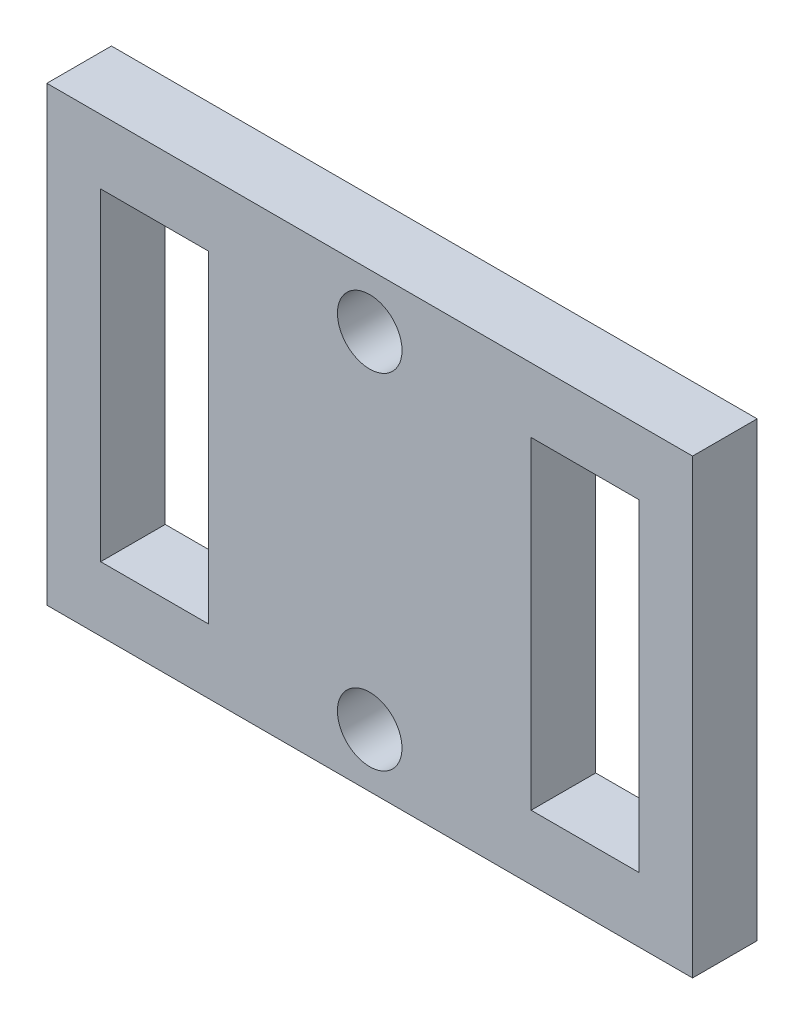
ISO-10303-21;
HEADER;
FILE_DESCRIPTION(('STEP AP214'),'2;1');
FILE_NAME('part.step','',(''),(''),'','','');
FILE_SCHEMA(('AUTOMOTIVE_DESIGN { 1 0 10303 214 1 1 1 1 }'));
ENDSEC;
DATA;
#1=APPLICATION_CONTEXT('core data for automotive mechanical design processes');
#2=APPLICATION_PROTOCOL_DEFINITION('international standard','automotive_design',2000,#1);
#3=PRODUCT_CONTEXT('',#1,'mechanical');
#4=PRODUCT('Part','Part','',(#3));
#5=PRODUCT_RELATED_PRODUCT_CATEGORY('part','',(#4));
#6=PRODUCT_DEFINITION_FORMATION('','',#4);
#7=PRODUCT_DEFINITION_CONTEXT('part definition',#1,'design');
#8=PRODUCT_DEFINITION('design','',#6,#7);
#9=PRODUCT_DEFINITION_SHAPE('','',#8);
#10=(LENGTH_UNIT() NAMED_UNIT(*) SI_UNIT(.MILLI.,.METRE.));
#11=(NAMED_UNIT(*) PLANE_ANGLE_UNIT() SI_UNIT($,.RADIAN.));
#12=(NAMED_UNIT(*) SI_UNIT($,.STERADIAN.) SOLID_ANGLE_UNIT());
#13=UNCERTAINTY_MEASURE_WITH_UNIT(LENGTH_MEASURE(1.E-05),#10,'distance_accuracy_value','');
#14=(GEOMETRIC_REPRESENTATION_CONTEXT(3) GLOBAL_UNCERTAINTY_ASSIGNED_CONTEXT((#13)) GLOBAL_UNIT_ASSIGNED_CONTEXT((#10,
#11,#12)) REPRESENTATION_CONTEXT('',''));
#15=CARTESIAN_POINT('',(0.,0.,0.));
#16=DIRECTION('',(0.,0.,1.));
#17=DIRECTION('',(1.,0.,0.));
#18=AXIS2_PLACEMENT_3D('',#15,#16,#17);
#19=CARTESIAN_POINT('',(0.,0.,3.));
#20=DIRECTION('',(0.,0.,1.));
#21=DIRECTION('',(1.,0.,0.));
#22=AXIS2_PLACEMENT_3D('',#19,#20,#21);
#23=PLANE('',#22);
#24=DIRECTION('',(0.,1.,0.));
#25=VECTOR('',#24,1.);
#26=CARTESIAN_POINT('',(-7.5,7.5,3.));
#27=LINE('',#26,#25);
#28=CARTESIAN_POINT('',(-7.5,-7.5,3.));
#29=VERTEX_POINT('',#28);
#30=CARTESIAN_POINT('',(-7.5,7.5,3.));
#31=VERTEX_POINT('',#30);
#32=EDGE_CURVE('E55',#29,#31,#27,.T.);
#33=ORIENTED_EDGE('',*,*,#32,.F.);
#34=DIRECTION('',(1.,0.,0.));
#35=VECTOR('',#34,1.);
#36=CARTESIAN_POINT('',(-12.5,-7.5,3.));
#37=LINE('',#36,#35);
#38=CARTESIAN_POINT('',(-12.5,-7.5,3.));
#39=VERTEX_POINT('',#38);
#40=EDGE_CURVE('E153',#39,#29,#37,.T.);
#41=ORIENTED_EDGE('',*,*,#40,.F.);
#42=DIRECTION('',(0.,-1.,0.));
#43=VECTOR('',#42,1.);
#44=CARTESIAN_POINT('',(-12.5,7.5,3.));
#45=LINE('',#44,#43);
#46=CARTESIAN_POINT('',(-12.5,7.5,3.));
#47=VERTEX_POINT('',#46);
#48=EDGE_CURVE('E157',#47,#39,#45,.T.);
#49=ORIENTED_EDGE('',*,*,#48,.F.);
#50=DIRECTION('',(-1.,0.,0.));
#51=VECTOR('',#50,1.);
#52=CARTESIAN_POINT('',(-12.5,7.5,3.));
#53=LINE('',#52,#51);
#54=EDGE_CURVE('E166',#31,#47,#53,.T.);
#55=ORIENTED_EDGE('',*,*,#54,.F.);
#56=EDGE_LOOP('',(#33,#41,#49,#55));
#57=FACE_BOUND('',#56,.T.);
#58=DIRECTION('',(0.,1.,0.));
#59=VECTOR('',#58,1.);
#60=CARTESIAN_POINT('',(12.5,7.5,3.));
#61=LINE('',#60,#59);
#62=CARTESIAN_POINT('',(12.5,-7.5,3.));
#63=VERTEX_POINT('',#62);
#64=CARTESIAN_POINT('',(12.5,7.5,3.));
#65=VERTEX_POINT('',#64);
#66=EDGE_CURVE('E63',#63,#65,#61,.T.);
#67=ORIENTED_EDGE('',*,*,#66,.F.);
#68=DIRECTION('',(1.,0.,0.));
#69=VECTOR('',#68,1.);
#70=CARTESIAN_POINT('',(12.5,-7.5,3.));
#71=LINE('',#70,#69);
#72=CARTESIAN_POINT('',(7.5,-7.5,3.));
#73=VERTEX_POINT('',#72);
#74=EDGE_CURVE('E187',#73,#63,#71,.T.);
#75=ORIENTED_EDGE('',*,*,#74,.F.);
#76=DIRECTION('',(0.,-1.,0.));
#77=VECTOR('',#76,1.);
#78=CARTESIAN_POINT('',(7.5,7.5,3.));
#79=LINE('',#78,#77);
#80=CARTESIAN_POINT('',(7.5,7.5,3.));
#81=VERTEX_POINT('',#80);
#82=EDGE_CURVE('E206',#81,#73,#79,.T.);
#83=ORIENTED_EDGE('',*,*,#82,.F.);
#84=DIRECTION('',(-1.,0.,0.));
#85=VECTOR('',#84,1.);
#86=CARTESIAN_POINT('',(12.5,7.5,3.));
#87=LINE('',#86,#85);
#88=EDGE_CURVE('E202',#65,#81,#87,.T.);
#89=ORIENTED_EDGE('',*,*,#88,.F.);
#90=EDGE_LOOP('',(#67,#75,#83,#89));
#91=FACE_BOUND('',#90,.T.);
#92=CARTESIAN_POINT('',(0.,8.,3.));
#93=DIRECTION('',(0.,0.,1.));
#94=DIRECTION('',(1.,0.,0.));
#95=AXIS2_PLACEMENT_3D('',#92,#93,#94);
#96=CIRCLE('',#95,1.5);
#97=CARTESIAN_POINT('',(1.5,8.,3.));
#98=VERTEX_POINT('',#97);
#99=EDGE_CURVE('E231',#98,#98,#96,.T.);
#100=ORIENTED_EDGE('',*,*,#99,.F.);
#101=EDGE_LOOP('',(#100));
#102=FACE_BOUND('',#101,.T.);
#103=DIRECTION('',(0.,1.,0.));
#104=VECTOR('',#103,1.);
#105=CARTESIAN_POINT('',(15.,10.5,3.));
#106=LINE('',#105,#104);
#107=CARTESIAN_POINT('',(15.,-10.5,3.));
#108=VERTEX_POINT('',#107);
#109=CARTESIAN_POINT('',(15.,10.5,3.));
#110=VERTEX_POINT('',#109);
#111=EDGE_CURVE('E239',#108,#110,#106,.T.);
#112=ORIENTED_EDGE('',*,*,#111,.T.);
#113=DIRECTION('',(-1.,0.,0.));
#114=VECTOR('',#113,1.);
#115=CARTESIAN_POINT('',(-15.,10.5,3.));
#116=LINE('',#115,#114);
#117=CARTESIAN_POINT('',(-15.,10.5,3.));
#118=VERTEX_POINT('',#117);
#119=EDGE_CURVE('E243',#110,#118,#116,.T.);
#120=ORIENTED_EDGE('',*,*,#119,.T.);
#121=DIRECTION('',(0.,-1.,0.));
#122=VECTOR('',#121,1.);
#123=CARTESIAN_POINT('',(-15.,10.5,3.));
#124=LINE('',#123,#122);
#125=CARTESIAN_POINT('',(-15.,-10.5,3.));
#126=VERTEX_POINT('',#125);
#127=EDGE_CURVE('E247',#118,#126,#124,.T.);
#128=ORIENTED_EDGE('',*,*,#127,.T.);
#129=DIRECTION('',(1.,0.,0.));
#130=VECTOR('',#129,1.);
#131=CARTESIAN_POINT('',(-15.,-10.5,3.));
#132=LINE('',#131,#130);
#133=EDGE_CURVE('E250',#126,#108,#132,.T.);
#134=ORIENTED_EDGE('',*,*,#133,.T.);
#135=EDGE_LOOP('',(#112,#120,#128,#134));
#136=FACE_BOUND('',#135,.T.);
#137=CARTESIAN_POINT('',(0.,-7.99999999999999,3.));
#138=DIRECTION('',(0.,0.,1.));
#139=DIRECTION('',(-1.,0.,0.));
#140=AXIS2_PLACEMENT_3D('',#137,#138,#139);
#141=CIRCLE('',#140,1.5);
#142=CARTESIAN_POINT('',(-1.50000000000001,-7.99999999999999,3.));
#143=VERTEX_POINT('',#142);
#144=EDGE_CURVE('E223',#143,#143,#141,.T.);
#145=ORIENTED_EDGE('',*,*,#144,.F.);
#146=EDGE_LOOP('',(#145));
#147=FACE_BOUND('',#146,.T.);
#148=ADVANCED_FACE('F39',(#57,#91,#102,#136,#147),#23,.T.);
#149=CARTESIAN_POINT('',(0.,0.,0.));
#150=DIRECTION('',(0.,0.,1.));
#151=DIRECTION('',(1.,0.,0.));
#152=AXIS2_PLACEMENT_3D('',#149,#150,#151);
#153=PLANE('',#152);
#154=DIRECTION('',(1.,0.,0.));
#155=VECTOR('',#154,1.);
#156=CARTESIAN_POINT('',(-12.5,-7.5,0.));
#157=LINE('',#156,#155);
#158=CARTESIAN_POINT('',(-12.5,-7.5,0.));
#159=VERTEX_POINT('',#158);
#160=CARTESIAN_POINT('',(-7.5,-7.5,0.));
#161=VERTEX_POINT('',#160);
#162=EDGE_CURVE('E138',#159,#161,#157,.T.);
#163=ORIENTED_EDGE('',*,*,#162,.T.);
#164=DIRECTION('',(0.,1.,0.));
#165=VECTOR('',#164,1.);
#166=CARTESIAN_POINT('',(-7.5,7.5,0.));
#167=LINE('',#166,#165);
#168=CARTESIAN_POINT('',(-7.5,7.5,0.));
#169=VERTEX_POINT('',#168);
#170=EDGE_CURVE('E131',#161,#169,#167,.T.);
#171=ORIENTED_EDGE('',*,*,#170,.T.);
#172=DIRECTION('',(-1.,0.,0.));
#173=VECTOR('',#172,1.);
#174=CARTESIAN_POINT('',(-12.5,7.5,0.));
#175=LINE('',#174,#173);
#176=CARTESIAN_POINT('',(-12.5,7.5,0.));
#177=VERTEX_POINT('',#176);
#178=EDGE_CURVE('E142',#169,#177,#175,.T.);
#179=ORIENTED_EDGE('',*,*,#178,.T.);
#180=DIRECTION('',(0.,-1.,0.));
#181=VECTOR('',#180,1.);
#182=CARTESIAN_POINT('',(-12.5,7.5,0.));
#183=LINE('',#182,#181);
#184=EDGE_CURVE('E147',#177,#159,#183,.T.);
#185=ORIENTED_EDGE('',*,*,#184,.T.);
#186=EDGE_LOOP('',(#163,#171,#179,#185));
#187=FACE_BOUND('',#186,.T.);
#188=DIRECTION('',(1.,0.,0.));
#189=VECTOR('',#188,1.);
#190=CARTESIAN_POINT('',(12.5,-7.5,0.));
#191=LINE('',#190,#189);
#192=CARTESIAN_POINT('',(7.5,-7.5,0.));
#193=VERTEX_POINT('',#192);
#194=CARTESIAN_POINT('',(12.5,-7.5,0.));
#195=VERTEX_POINT('',#194);
#196=EDGE_CURVE('E195',#193,#195,#191,.T.);
#197=ORIENTED_EDGE('',*,*,#196,.T.);
#198=DIRECTION('',(0.,1.,0.));
#199=VECTOR('',#198,1.);
#200=CARTESIAN_POINT('',(12.5,7.5,0.));
#201=LINE('',#200,#199);
#202=CARTESIAN_POINT('',(12.5,7.5,0.));
#203=VERTEX_POINT('',#202);
#204=EDGE_CURVE('E182',#195,#203,#201,.T.);
#205=ORIENTED_EDGE('',*,*,#204,.T.);
#206=DIRECTION('',(-1.,0.,0.));
#207=VECTOR('',#206,1.);
#208=CARTESIAN_POINT('',(12.5,7.5,0.));
#209=LINE('',#208,#207);
#210=CARTESIAN_POINT('',(7.5,7.5,0.));
#211=VERTEX_POINT('',#210);
#212=EDGE_CURVE('E186',#203,#211,#209,.T.);
#213=ORIENTED_EDGE('',*,*,#212,.T.);
#214=DIRECTION('',(0.,-1.,0.));
#215=VECTOR('',#214,1.);
#216=CARTESIAN_POINT('',(7.5,7.5,0.));
#217=LINE('',#216,#215);
#218=EDGE_CURVE('E191',#211,#193,#217,.T.);
#219=ORIENTED_EDGE('',*,*,#218,.T.);
#220=EDGE_LOOP('',(#197,#205,#213,#219));
#221=FACE_BOUND('',#220,.T.);
#222=DIRECTION('',(0.,1.,0.));
#223=VECTOR('',#222,1.);
#224=CARTESIAN_POINT('',(15.,10.5,0.));
#225=LINE('',#224,#223);
#226=CARTESIAN_POINT('',(15.,-10.5,0.));
#227=VERTEX_POINT('',#226);
#228=CARTESIAN_POINT('',(15.,10.5,0.));
#229=VERTEX_POINT('',#228);
#230=EDGE_CURVE('E235',#227,#229,#225,.T.);
#231=ORIENTED_EDGE('',*,*,#230,.F.);
#232=DIRECTION('',(1.,0.,0.));
#233=VECTOR('',#232,1.);
#234=CARTESIAN_POINT('',(-15.,-10.5,0.));
#235=LINE('',#234,#233);
#236=CARTESIAN_POINT('',(-15.,-10.5,0.));
#237=VERTEX_POINT('',#236);
#238=EDGE_CURVE('E244',#237,#227,#235,.T.);
#239=ORIENTED_EDGE('',*,*,#238,.F.);
#240=DIRECTION('',(0.,-1.,0.));
#241=VECTOR('',#240,1.);
#242=CARTESIAN_POINT('',(-15.,10.5,0.));
#243=LINE('',#242,#241);
#244=CARTESIAN_POINT('',(-15.,10.5,0.));
#245=VERTEX_POINT('',#244);
#246=EDGE_CURVE('E260',#245,#237,#243,.T.);
#247=ORIENTED_EDGE('',*,*,#246,.F.);
#248=DIRECTION('',(-1.,0.,0.));
#249=VECTOR('',#248,1.);
#250=CARTESIAN_POINT('',(-15.,10.5,0.));
#251=LINE('',#250,#249);
#252=EDGE_CURVE('E257',#229,#245,#251,.T.);
#253=ORIENTED_EDGE('',*,*,#252,.F.);
#254=EDGE_LOOP('',(#231,#239,#247,#253));
#255=FACE_BOUND('',#254,.T.);
#256=CARTESIAN_POINT('',(0.,8.,0.));
#257=DIRECTION('',(0.,0.,1.));
#258=DIRECTION('',(1.,0.,0.));
#259=AXIS2_PLACEMENT_3D('',#256,#257,#258);
#260=CIRCLE('',#259,1.5);
#261=CARTESIAN_POINT('',(1.5,8.,0.));
#262=VERTEX_POINT('',#261);
#263=EDGE_CURVE('E227',#262,#262,#260,.T.);
#264=ORIENTED_EDGE('',*,*,#263,.T.);
#265=EDGE_LOOP('',(#264));
#266=FACE_BOUND('',#265,.T.);
#267=CARTESIAN_POINT('',(0.,-7.99999999999999,0.));
#268=DIRECTION('',(0.,0.,1.));
#269=DIRECTION('',(-1.,0.,0.));
#270=AXIS2_PLACEMENT_3D('',#267,#268,#269);
#271=CIRCLE('',#270,1.5);
#272=CARTESIAN_POINT('',(-1.50000000000001,-7.99999999999999,0.));
#273=VERTEX_POINT('',#272);
#274=EDGE_CURVE('E176',#273,#273,#271,.T.);
#275=ORIENTED_EDGE('',*,*,#274,.T.);
#276=EDGE_LOOP('',(#275));
#277=FACE_BOUND('',#276,.T.);
#278=ADVANCED_FACE('F149',(#187,#221,#255,#266,#277),#153,.F.);
#279=CARTESIAN_POINT('',(15.,10.5,3.));
#280=DIRECTION('',(-1.,0.,0.));
#281=DIRECTION('',(0.,-1.,0.));
#282=AXIS2_PLACEMENT_3D('',#279,#280,#281);
#283=PLANE('',#282);
#284=ORIENTED_EDGE('',*,*,#230,.T.);
#285=DIRECTION('',(0.,0.,-1.));
#286=VECTOR('',#285,1.);
#287=CARTESIAN_POINT('',(15.,10.5,3.));
#288=LINE('',#287,#286);
#289=EDGE_CURVE('E11',#110,#229,#288,.T.);
#290=ORIENTED_EDGE('',*,*,#289,.F.);
#291=ORIENTED_EDGE('',*,*,#111,.F.);
#292=DIRECTION('',(0.,0.,-1.));
#293=VECTOR('',#292,1.);
#294=CARTESIAN_POINT('',(15.,-10.5,3.));
#295=LINE('',#294,#293);
#296=EDGE_CURVE('E253',#108,#227,#295,.T.);
#297=ORIENTED_EDGE('',*,*,#296,.T.);
#298=EDGE_LOOP('',(#284,#290,#291,#297));
#299=FACE_BOUND('',#298,.T.);
#300=ADVANCED_FACE('F41',(#299),#283,.F.);
#301=CARTESIAN_POINT('',(-15.,10.5,3.));
#302=DIRECTION('',(0.,-1.,0.));
#303=DIRECTION('',(0.,0.,-1.));
#304=AXIS2_PLACEMENT_3D('',#301,#302,#303);
#305=PLANE('',#304);
#306=ORIENTED_EDGE('',*,*,#252,.T.);
#307=DIRECTION('',(0.,0.,-1.));
#308=VECTOR('',#307,1.);
#309=CARTESIAN_POINT('',(-15.,10.5,3.));
#310=LINE('',#309,#308);
#311=EDGE_CURVE('E48',#118,#245,#310,.T.);
#312=ORIENTED_EDGE('',*,*,#311,.F.);
#313=ORIENTED_EDGE('',*,*,#119,.F.);
#314=ORIENTED_EDGE('',*,*,#289,.T.);
#315=EDGE_LOOP('',(#306,#312,#313,#314));
#316=FACE_BOUND('',#315,.T.);
#317=ADVANCED_FACE('F293',(#316),#305,.F.);
#318=CARTESIAN_POINT('',(-15.,10.5,3.));
#319=DIRECTION('',(1.,0.,0.));
#320=DIRECTION('',(0.,0.,-1.));
#321=AXIS2_PLACEMENT_3D('',#318,#319,#320);
#322=PLANE('',#321);
#323=ORIENTED_EDGE('',*,*,#246,.T.);
#324=DIRECTION('',(0.,0.,-1.));
#325=VECTOR('',#324,1.);
#326=CARTESIAN_POINT('',(-15.,-10.5,3.));
#327=LINE('',#326,#325);
#328=EDGE_CURVE('E268',#126,#237,#327,.T.);
#329=ORIENTED_EDGE('',*,*,#328,.F.);
#330=ORIENTED_EDGE('',*,*,#127,.F.);
#331=ORIENTED_EDGE('',*,*,#311,.T.);
#332=EDGE_LOOP('',(#323,#329,#330,#331));
#333=FACE_BOUND('',#332,.T.);
#334=ADVANCED_FACE('F277',(#333),#322,.F.);
#335=CARTESIAN_POINT('',(-15.,-10.5,3.));
#336=DIRECTION('',(0.,1.,0.));
#337=DIRECTION('',(0.,0.,1.));
#338=AXIS2_PLACEMENT_3D('',#335,#336,#337);
#339=PLANE('',#338);
#340=ORIENTED_EDGE('',*,*,#238,.T.);
#341=ORIENTED_EDGE('',*,*,#296,.F.);
#342=ORIENTED_EDGE('',*,*,#133,.F.);
#343=ORIENTED_EDGE('',*,*,#328,.T.);
#344=EDGE_LOOP('',(#340,#341,#342,#343));
#345=FACE_BOUND('',#344,.T.);
#346=ADVANCED_FACE('F286',(#345),#339,.F.);
#347=CARTESIAN_POINT('',(0.,8.,3.));
#348=DIRECTION('',(0.,0.,-1.));
#349=DIRECTION('',(-1.,0.,0.));
#350=AXIS2_PLACEMENT_3D('',#347,#348,#349);
#351=CYLINDRICAL_SURFACE('',#350,1.5);
#352=ORIENTED_EDGE('',*,*,#99,.T.);
#353=EDGE_LOOP('',(#352));
#354=FACE_BOUND('',#353,.T.);
#355=ORIENTED_EDGE('',*,*,#263,.F.);
#356=EDGE_LOOP('',(#355));
#357=FACE_BOUND('',#356,.T.);
#358=ADVANCED_FACE('F309',(#354,#357),#351,.F.);
#359=CARTESIAN_POINT('',(0.,-7.99999999999999,3.));
#360=DIRECTION('',(0.,0.,-1.));
#361=DIRECTION('',(-1.,0.,0.));
#362=AXIS2_PLACEMENT_3D('',#359,#360,#361);
#363=CYLINDRICAL_SURFACE('',#362,1.5);
#364=ORIENTED_EDGE('',*,*,#144,.T.);
#365=EDGE_LOOP('',(#364));
#366=FACE_BOUND('',#365,.T.);
#367=ORIENTED_EDGE('',*,*,#274,.F.);
#368=EDGE_LOOP('',(#367));
#369=FACE_BOUND('',#368,.T.);
#370=ADVANCED_FACE('F316',(#366,#369),#363,.F.);
#371=CARTESIAN_POINT('',(12.5,7.5,0.));
#372=DIRECTION('',(1.,0.,0.));
#373=DIRECTION('',(0.,0.,-1.));
#374=AXIS2_PLACEMENT_3D('',#371,#372,#373);
#375=PLANE('',#374);
#376=ORIENTED_EDGE('',*,*,#66,.T.);
#377=DIRECTION('',(0.,0.,1.));
#378=VECTOR('',#377,1.);
#379=CARTESIAN_POINT('',(12.5,7.5,0.));
#380=LINE('',#379,#378);
#381=EDGE_CURVE('E199',#203,#65,#380,.T.);
#382=ORIENTED_EDGE('',*,*,#381,.F.);
#383=ORIENTED_EDGE('',*,*,#204,.F.);
#384=DIRECTION('',(0.,0.,1.));
#385=VECTOR('',#384,1.);
#386=CARTESIAN_POINT('',(12.5,-7.5,0.));
#387=LINE('',#386,#385);
#388=EDGE_CURVE('E167',#195,#63,#387,.T.);
#389=ORIENTED_EDGE('',*,*,#388,.T.);
#390=EDGE_LOOP('',(#376,#382,#383,#389));
#391=FACE_BOUND('',#390,.T.);
#392=ADVANCED_FACE('F321',(#391),#375,.F.);
#393=CARTESIAN_POINT('',(12.5,-7.5,0.));
#394=DIRECTION('',(0.,-1.,0.));
#395=DIRECTION('',(1.,0.,0.));
#396=AXIS2_PLACEMENT_3D('',#393,#394,#395);
#397=PLANE('',#396);
#398=ORIENTED_EDGE('',*,*,#74,.T.);
#399=ORIENTED_EDGE('',*,*,#388,.F.);
#400=ORIENTED_EDGE('',*,*,#196,.F.);
#401=DIRECTION('',(0.,0.,1.));
#402=VECTOR('',#401,1.);
#403=CARTESIAN_POINT('',(7.5,-7.5,0.));
#404=LINE('',#403,#402);
#405=EDGE_CURVE('E215',#193,#73,#404,.T.);
#406=ORIENTED_EDGE('',*,*,#405,.T.);
#407=EDGE_LOOP('',(#398,#399,#400,#406));
#408=FACE_BOUND('',#407,.T.);
#409=ADVANCED_FACE('F333',(#408),#397,.F.);
#410=CARTESIAN_POINT('',(7.5,7.5,0.));
#411=DIRECTION('',(-1.,0.,0.));
#412=DIRECTION('',(0.,-1.,0.));
#413=AXIS2_PLACEMENT_3D('',#410,#411,#412);
#414=PLANE('',#413);
#415=ORIENTED_EDGE('',*,*,#82,.T.);
#416=ORIENTED_EDGE('',*,*,#405,.F.);
#417=ORIENTED_EDGE('',*,*,#218,.F.);
#418=DIRECTION('',(0.,0.,1.));
#419=VECTOR('',#418,1.);
#420=CARTESIAN_POINT('',(7.5,7.5,0.));
#421=LINE('',#420,#419);
#422=EDGE_CURVE('E218',#211,#81,#421,.T.);
#423=ORIENTED_EDGE('',*,*,#422,.T.);
#424=EDGE_LOOP('',(#415,#416,#417,#423));
#425=FACE_BOUND('',#424,.T.);
#426=ADVANCED_FACE('F339',(#425),#414,.F.);
#427=CARTESIAN_POINT('',(12.5,7.5,0.));
#428=DIRECTION('',(0.,1.,0.));
#429=DIRECTION('',(-1.,0.,0.));
#430=AXIS2_PLACEMENT_3D('',#427,#428,#429);
#431=PLANE('',#430);
#432=ORIENTED_EDGE('',*,*,#88,.T.);
#433=ORIENTED_EDGE('',*,*,#422,.F.);
#434=ORIENTED_EDGE('',*,*,#212,.F.);
#435=ORIENTED_EDGE('',*,*,#381,.T.);
#436=EDGE_LOOP('',(#432,#433,#434,#435));
#437=FACE_BOUND('',#436,.T.);
#438=ADVANCED_FACE('F336',(#437),#431,.F.);
#439=CARTESIAN_POINT('',(-7.5,7.5,0.));
#440=DIRECTION('',(1.,0.,0.));
#441=DIRECTION('',(0.,1.,0.));
#442=AXIS2_PLACEMENT_3D('',#439,#440,#441);
#443=PLANE('',#442);
#444=ORIENTED_EDGE('',*,*,#32,.T.);
#445=DIRECTION('',(0.,0.,1.));
#446=VECTOR('',#445,1.);
#447=CARTESIAN_POINT('',(-7.5,7.5,0.));
#448=LINE('',#447,#446);
#449=EDGE_CURVE('E127',#169,#31,#448,.T.);
#450=ORIENTED_EDGE('',*,*,#449,.F.);
#451=ORIENTED_EDGE('',*,*,#170,.F.);
#452=DIRECTION('',(0.,0.,1.));
#453=VECTOR('',#452,1.);
#454=CARTESIAN_POINT('',(-7.5,-7.5,0.));
#455=LINE('',#454,#453);
#456=EDGE_CURVE('E173',#161,#29,#455,.T.);
#457=ORIENTED_EDGE('',*,*,#456,.T.);
#458=EDGE_LOOP('',(#444,#450,#451,#457));
#459=FACE_BOUND('',#458,.T.);
#460=ADVANCED_FACE('F129',(#459),#443,.F.);
#461=CARTESIAN_POINT('',(-12.5,-7.5,0.));
#462=DIRECTION('',(0.,-1.,0.));
#463=DIRECTION('',(1.,0.,0.));
#464=AXIS2_PLACEMENT_3D('',#461,#462,#463);
#465=PLANE('',#464);
#466=ORIENTED_EDGE('',*,*,#40,.T.);
#467=ORIENTED_EDGE('',*,*,#456,.F.);
#468=ORIENTED_EDGE('',*,*,#162,.F.);
#469=DIRECTION('',(0.,0.,1.));
#470=VECTOR('',#469,1.);
#471=CARTESIAN_POINT('',(-12.5,-7.5,0.));
#472=LINE('',#471,#470);
#473=EDGE_CURVE('E177',#159,#39,#472,.T.);
#474=ORIENTED_EDGE('',*,*,#473,.T.);
#475=EDGE_LOOP('',(#466,#467,#468,#474));
#476=FACE_BOUND('',#475,.T.);
#477=ADVANCED_FACE('F349',(#476),#465,.F.);
#478=CARTESIAN_POINT('',(-12.5,7.5,0.));
#479=DIRECTION('',(-1.,0.,0.));
#480=DIRECTION('',(0.,-1.,0.));
#481=AXIS2_PLACEMENT_3D('',#478,#479,#480);
#482=PLANE('',#481);
#483=ORIENTED_EDGE('',*,*,#48,.T.);
#484=ORIENTED_EDGE('',*,*,#473,.F.);
#485=ORIENTED_EDGE('',*,*,#184,.F.);
#486=DIRECTION('',(0.,0.,1.));
#487=VECTOR('',#486,1.);
#488=CARTESIAN_POINT('',(-12.5,7.5,0.));
#489=LINE('',#488,#487);
#490=EDGE_CURVE('E137',#177,#47,#489,.T.);
#491=ORIENTED_EDGE('',*,*,#490,.T.);
#492=EDGE_LOOP('',(#483,#484,#485,#491));
#493=FACE_BOUND('',#492,.T.);
#494=ADVANCED_FACE('F352',(#493),#482,.F.);
#495=CARTESIAN_POINT('',(-12.5,7.5,0.));
#496=DIRECTION('',(0.,1.,0.));
#497=DIRECTION('',(0.,0.,1.));
#498=AXIS2_PLACEMENT_3D('',#495,#496,#497);
#499=PLANE('',#498);
#500=ORIENTED_EDGE('',*,*,#54,.T.);
#501=ORIENTED_EDGE('',*,*,#490,.F.);
#502=ORIENTED_EDGE('',*,*,#178,.F.);
#503=ORIENTED_EDGE('',*,*,#449,.T.);
#504=EDGE_LOOP('',(#500,#501,#502,#503));
#505=FACE_BOUND('',#504,.T.);
#506=ADVANCED_FACE('F143',(#505),#499,.F.);
#507=CLOSED_SHELL('',(#148,#278,#300,#317,#334,#346,#358,#370,#392,#409,#426,#438,#460,#477,
#494,#506));
#508=MANIFOLD_SOLID_BREP('B2',#507);
#509=ADVANCED_BREP_SHAPE_REPRESENTATION('',(#18,#508),#14);
#510=SHAPE_DEFINITION_REPRESENTATION(#9,#509);
ENDSEC;
END-ISO-10303-21;
